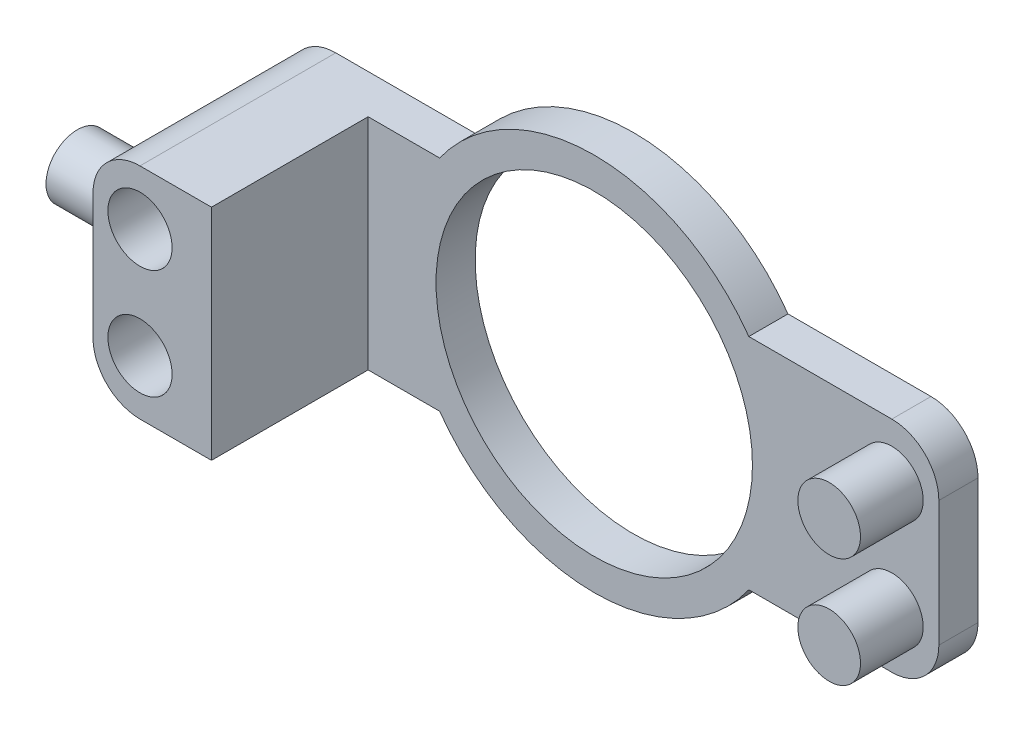
ISO-10303-21;
HEADER;
FILE_DESCRIPTION(('STEP AP214'),'2;1');
FILE_NAME('part.step','',(''),(''),'','','');
FILE_SCHEMA(('AUTOMOTIVE_DESIGN { 1 0 10303 214 1 1 1 1 }'));
ENDSEC;
DATA;
#1=APPLICATION_CONTEXT('core data for automotive mechanical design processes');
#2=APPLICATION_PROTOCOL_DEFINITION('international standard','automotive_design',2000,#1);
#3=PRODUCT_CONTEXT('',#1,'mechanical');
#4=PRODUCT('Part','Part','',(#3));
#5=PRODUCT_RELATED_PRODUCT_CATEGORY('part','',(#4));
#6=PRODUCT_DEFINITION_FORMATION('','',#4);
#7=PRODUCT_DEFINITION_CONTEXT('part definition',#1,'design');
#8=PRODUCT_DEFINITION('design','',#6,#7);
#9=PRODUCT_DEFINITION_SHAPE('','',#8);
#10=(LENGTH_UNIT() NAMED_UNIT(*) SI_UNIT(.MILLI.,.METRE.));
#11=(NAMED_UNIT(*) PLANE_ANGLE_UNIT() SI_UNIT($,.RADIAN.));
#12=(NAMED_UNIT(*) SI_UNIT($,.STERADIAN.) SOLID_ANGLE_UNIT());
#13=UNCERTAINTY_MEASURE_WITH_UNIT(LENGTH_MEASURE(1.E-05),#10,'distance_accuracy_value','');
#14=(GEOMETRIC_REPRESENTATION_CONTEXT(3) GLOBAL_UNCERTAINTY_ASSIGNED_CONTEXT((#13)) GLOBAL_UNIT_ASSIGNED_CONTEXT((#10,
#11,#12)) REPRESENTATION_CONTEXT('',''));
#15=CARTESIAN_POINT('',(0.,0.,0.));
#16=DIRECTION('',(0.,0.,1.));
#17=DIRECTION('',(1.,0.,0.));
#18=AXIS2_PLACEMENT_3D('',#15,#16,#17);
#19=CARTESIAN_POINT('',(0.,0.,2.5));
#20=DIRECTION('',(0.,0.,1.));
#21=DIRECTION('',(1.,0.,0.));
#22=AXIS2_PLACEMENT_3D('',#19,#20,#21);
#23=PLANE('',#22);
#24=CARTESIAN_POINT('',(19.,-3.5,2.5));
#25=DIRECTION('',(0.,0.,1.));
#26=DIRECTION('',(1.,0.,0.));
#27=AXIS2_PLACEMENT_3D('',#24,#25,#26);
#28=CIRCLE('',#27,2.);
#29=CARTESIAN_POINT('',(21.,-3.5,2.5));
#30=VERTEX_POINT('',#29);
#31=EDGE_CURVE('E277',#30,#30,#28,.T.);
#32=ORIENTED_EDGE('',*,*,#31,.F.);
#33=EDGE_LOOP('',(#32));
#34=FACE_BOUND('',#33,.T.);
#35=CARTESIAN_POINT('',(19.,3.5,2.5));
#36=DIRECTION('',(0.,0.,1.));
#37=DIRECTION('',(1.,0.,0.));
#38=AXIS2_PLACEMENT_3D('',#35,#36,#37);
#39=CIRCLE('',#38,2.);
#40=CARTESIAN_POINT('',(21.,3.5,2.5));
#41=VERTEX_POINT('',#40);
#42=EDGE_CURVE('E274',#41,#41,#39,.T.);
#43=ORIENTED_EDGE('',*,*,#42,.F.);
#44=EDGE_LOOP('',(#43));
#45=FACE_BOUND('',#44,.T.);
#46=CARTESIAN_POINT('',(0.,0.,2.5));
#47=DIRECTION('',(0.,0.,1.));
#48=DIRECTION('',(1.,0.,0.));
#49=AXIS2_PLACEMENT_3D('',#46,#47,#48);
#50=CIRCLE('',#49,10.1);
#51=CARTESIAN_POINT('',(10.1,0.,2.5));
#52=VERTEX_POINT('',#51);
#53=EDGE_CURVE('E189',#52,#52,#50,.T.);
#54=ORIENTED_EDGE('',*,*,#53,.F.);
#55=EDGE_LOOP('',(#54));
#56=FACE_BOUND('',#55,.T.);
#57=DIRECTION('',(1.,0.,0.));
#58=VECTOR('',#57,1.);
#59=CARTESIAN_POINT('',(0.,7.,2.5));
#60=LINE('',#59,#58);
#61=CARTESIAN_POINT('',(-14.4348252248687,7.,2.5));
#62=VERTEX_POINT('',#61);
#63=CARTESIAN_POINT('',(-9.86965044973731,7.,2.5));
#64=VERTEX_POINT('',#63);
#65=EDGE_CURVE('E199',#62,#64,#60,.T.);
#66=ORIENTED_EDGE('',*,*,#65,.F.);
#67=DIRECTION('',(0.,-1.,0.));
#68=VECTOR('',#67,1.);
#69=CARTESIAN_POINT('',(-14.4348252248687,0.,2.5));
#70=LINE('',#69,#68);
#71=CARTESIAN_POINT('',(-14.4348252248687,-7.00000000000001,2.5));
#72=VERTEX_POINT('',#71);
#73=EDGE_CURVE('E155',#62,#72,#70,.T.);
#74=ORIENTED_EDGE('',*,*,#73,.T.);
#75=DIRECTION('',(1.,0.,0.));
#76=VECTOR('',#75,1.);
#77=CARTESIAN_POINT('',(0.,-7.00000000000001,2.5));
#78=LINE('',#77,#76);
#79=CARTESIAN_POINT('',(-9.86965044973731,-7.00000000000001,2.5));
#80=VERTEX_POINT('',#79);
#81=EDGE_CURVE('E201',#72,#80,#78,.T.);
#82=ORIENTED_EDGE('',*,*,#81,.T.);
#83=CARTESIAN_POINT('',(0.,0.,2.5));
#84=DIRECTION('',(0.,0.,1.));
#85=DIRECTION('',(1.,0.,0.));
#86=AXIS2_PLACEMENT_3D('',#83,#84,#85);
#87=CIRCLE('',#86,12.1);
#88=CARTESIAN_POINT('',(9.86965044973731,-7.00000000000001,2.5));
#89=VERTEX_POINT('',#88);
#90=EDGE_CURVE('E203',#80,#89,#87,.T.);
#91=ORIENTED_EDGE('',*,*,#90,.T.);
#92=DIRECTION('',(1.,0.,0.));
#93=VECTOR('',#92,1.);
#94=CARTESIAN_POINT('',(0.,-7.00000000000001,2.5));
#95=LINE('',#94,#93);
#96=CARTESIAN_POINT('',(19.,-7.00000000000001,2.5));
#97=VERTEX_POINT('',#96);
#98=EDGE_CURVE('E206',#89,#97,#95,.T.);
#99=ORIENTED_EDGE('',*,*,#98,.T.);
#100=CARTESIAN_POINT('',(19.,-4.00000000000001,2.5));
#101=DIRECTION('',(0.,0.,1.));
#102=DIRECTION('',(1.,0.,0.));
#103=AXIS2_PLACEMENT_3D('',#100,#101,#102);
#104=CIRCLE('',#103,3.);
#105=CARTESIAN_POINT('',(22.,-4.00000000000001,2.5));
#106=VERTEX_POINT('',#105);
#107=EDGE_CURVE('E260',#97,#106,#104,.T.);
#108=ORIENTED_EDGE('',*,*,#107,.T.);
#109=DIRECTION('',(0.,1.,0.));
#110=VECTOR('',#109,1.);
#111=CARTESIAN_POINT('',(22.,0.,2.5));
#112=LINE('',#111,#110);
#113=CARTESIAN_POINT('',(22.,4.00000000000001,2.5));
#114=VERTEX_POINT('',#113);
#115=EDGE_CURVE('E208',#106,#114,#112,.T.);
#116=ORIENTED_EDGE('',*,*,#115,.T.);
#117=CARTESIAN_POINT('',(19.,4.00000000000001,2.5));
#118=DIRECTION('',(0.,0.,1.));
#119=DIRECTION('',(1.,0.,0.));
#120=AXIS2_PLACEMENT_3D('',#117,#118,#119);
#121=CIRCLE('',#120,3.);
#122=CARTESIAN_POINT('',(19.,7.00000000000001,2.5));
#123=VERTEX_POINT('',#122);
#124=EDGE_CURVE('E262',#114,#123,#121,.T.);
#125=ORIENTED_EDGE('',*,*,#124,.T.);
#126=DIRECTION('',(1.,0.,0.));
#127=VECTOR('',#126,1.);
#128=CARTESIAN_POINT('',(0.,7.,2.5));
#129=LINE('',#128,#127);
#130=CARTESIAN_POINT('',(9.86965044973731,7.,2.5));
#131=VERTEX_POINT('',#130);
#132=EDGE_CURVE('E192',#131,#123,#129,.T.);
#133=ORIENTED_EDGE('',*,*,#132,.F.);
#134=CARTESIAN_POINT('',(0.,0.,2.5));
#135=DIRECTION('',(0.,0.,1.));
#136=DIRECTION('',(1.,0.,0.));
#137=AXIS2_PLACEMENT_3D('',#134,#135,#136);
#138=CIRCLE('',#137,12.1);
#139=EDGE_CURVE('E196',#131,#64,#138,.T.);
#140=ORIENTED_EDGE('',*,*,#139,.T.);
#141=EDGE_LOOP('',(#66,#74,#82,#91,#99,#108,#116,#125,#133,#140));
#142=FACE_BOUND('',#141,.T.);
#143=ADVANCED_FACE('F49',(#34,#45,#56,#142),#23,.T.);
#144=CARTESIAN_POINT('',(0.,7.,2.5));
#145=DIRECTION('',(0.,1.,0.));
#146=DIRECTION('',(-1.,0.,0.));
#147=AXIS2_PLACEMENT_3D('',#144,#145,#146);
#148=PLANE('',#147);
#149=ORIENTED_EDGE('',*,*,#132,.T.);
#150=DIRECTION('',(0.,0.,-1.));
#151=VECTOR('',#150,1.);
#152=CARTESIAN_POINT('',(19.,7.00000000000001,0.));
#153=LINE('',#152,#151);
#154=CARTESIAN_POINT('',(19.,7.00000000000001,0.));
#155=VERTEX_POINT('',#154);
#156=EDGE_CURVE('E244',#123,#155,#153,.T.);
#157=ORIENTED_EDGE('',*,*,#156,.T.);
#158=DIRECTION('',(1.,0.,0.));
#159=VECTOR('',#158,1.);
#160=CARTESIAN_POINT('',(0.,7.,0.));
#161=LINE('',#160,#159);
#162=CARTESIAN_POINT('',(9.86965044973731,7.,0.));
#163=VERTEX_POINT('',#162);
#164=EDGE_CURVE('E214',#163,#155,#161,.T.);
#165=ORIENTED_EDGE('',*,*,#164,.F.);
#166=DIRECTION('',(0.,0.,-1.));
#167=VECTOR('',#166,1.);
#168=CARTESIAN_POINT('',(9.86965044973731,7.,2.5));
#169=LINE('',#168,#167);
#170=EDGE_CURVE('E242',#131,#163,#169,.T.);
#171=ORIENTED_EDGE('',*,*,#170,.F.);
#172=EDGE_LOOP('',(#149,#157,#165,#171));
#173=FACE_BOUND('',#172,.T.);
#174=ADVANCED_FACE('F296',(#173),#148,.T.);
#175=CARTESIAN_POINT('',(0.,0.,2.5));
#176=DIRECTION('',(0.,0.,-1.));
#177=DIRECTION('',(-1.,0.,0.));
#178=AXIS2_PLACEMENT_3D('',#175,#176,#177);
#179=CYLINDRICAL_SURFACE('',#178,12.1);
#180=CARTESIAN_POINT('',(0.,0.,0.));
#181=DIRECTION('',(0.,0.,1.));
#182=DIRECTION('',(1.,0.,0.));
#183=AXIS2_PLACEMENT_3D('',#180,#181,#182);
#184=CIRCLE('',#183,12.1);
#185=CARTESIAN_POINT('',(-9.86965044973731,7.,0.));
#186=VERTEX_POINT('',#185);
#187=EDGE_CURVE('E217',#163,#186,#184,.T.);
#188=ORIENTED_EDGE('',*,*,#187,.T.);
#189=DIRECTION('',(0.,0.,-1.));
#190=VECTOR('',#189,1.);
#191=CARTESIAN_POINT('',(-9.86965044973731,7.,2.5));
#192=LINE('',#191,#190);
#193=EDGE_CURVE('E239',#64,#186,#192,.T.);
#194=ORIENTED_EDGE('',*,*,#193,.F.);
#195=ORIENTED_EDGE('',*,*,#139,.F.);
#196=ORIENTED_EDGE('',*,*,#170,.T.);
#197=EDGE_LOOP('',(#188,#194,#195,#196));
#198=FACE_BOUND('',#197,.T.);
#199=ADVANCED_FACE('F302',(#198),#179,.T.);
#200=CARTESIAN_POINT('',(0.,7.,2.5));
#201=DIRECTION('',(0.,1.,0.));
#202=DIRECTION('',(-1.,0.,0.));
#203=AXIS2_PLACEMENT_3D('',#200,#201,#202);
#204=PLANE('',#203);
#205=DIRECTION('',(1.,0.,0.));
#206=VECTOR('',#205,1.);
#207=CARTESIAN_POINT('',(0.,7.,0.));
#208=LINE('',#207,#206);
#209=CARTESIAN_POINT('',(-19.,7.,0.));
#210=VERTEX_POINT('',#209);
#211=EDGE_CURVE('E220',#210,#186,#208,.T.);
#212=ORIENTED_EDGE('',*,*,#211,.F.);
#213=DIRECTION('',(0.,0.,-1.));
#214=VECTOR('',#213,1.);
#215=CARTESIAN_POINT('',(-19.,7.,2.5));
#216=LINE('',#215,#214);
#217=CARTESIAN_POINT('',(-19.,7.,12.5));
#218=VERTEX_POINT('',#217);
#219=EDGE_CURVE('E165',#210,#218,#216,.F.);
#220=ORIENTED_EDGE('',*,*,#219,.T.);
#221=DIRECTION('',(-1.,0.,0.));
#222=VECTOR('',#221,1.);
#223=CARTESIAN_POINT('',(0.,7.,12.5));
#224=LINE('',#223,#222);
#225=CARTESIAN_POINT('',(-14.4348252248687,7.,12.5));
#226=VERTEX_POINT('',#225);
#227=EDGE_CURVE('E161',#226,#218,#224,.T.);
#228=ORIENTED_EDGE('',*,*,#227,.F.);
#229=DIRECTION('',(0.,0.,-1.));
#230=VECTOR('',#229,1.);
#231=CARTESIAN_POINT('',(-14.4348252248687,7.,12.5));
#232=LINE('',#231,#230);
#233=EDGE_CURVE('E150',#226,#62,#232,.T.);
#234=ORIENTED_EDGE('',*,*,#233,.T.);
#235=ORIENTED_EDGE('',*,*,#65,.T.);
#236=ORIENTED_EDGE('',*,*,#193,.T.);
#237=EDGE_LOOP('',(#212,#220,#228,#234,#235,#236));
#238=FACE_BOUND('',#237,.T.);
#239=ADVANCED_FACE('F163',(#238),#204,.T.);
#240=CARTESIAN_POINT('',(-22.,0.,2.5));
#241=DIRECTION('',(-1.,0.,0.));
#242=DIRECTION('',(0.,0.,1.));
#243=AXIS2_PLACEMENT_3D('',#240,#241,#242);
#244=PLANE('',#243);
#245=CARTESIAN_POINT('',(-22.,0.,7.5));
#246=DIRECTION('',(-1.,0.,0.));
#247=DIRECTION('',(0.,0.,1.));
#248=AXIS2_PLACEMENT_3D('',#245,#246,#247);
#249=CIRCLE('',#248,3.);
#250=CARTESIAN_POINT('',(-22.,0.,10.5));
#251=VERTEX_POINT('',#250);
#252=EDGE_CURVE('E12',#251,#251,#249,.F.);
#253=ORIENTED_EDGE('',*,*,#252,.T.);
#254=EDGE_LOOP('',(#253));
#255=FACE_BOUND('',#254,.T.);
#256=DIRECTION('',(0.,1.,0.));
#257=VECTOR('',#256,1.);
#258=CARTESIAN_POINT('',(-22.,0.,0.));
#259=LINE('',#258,#257);
#260=CARTESIAN_POINT('',(-22.,-4.00000000000001,0.));
#261=VERTEX_POINT('',#260);
#262=CARTESIAN_POINT('',(-22.,4.,0.));
#263=VERTEX_POINT('',#262);
#264=EDGE_CURVE('E222',#261,#263,#259,.T.);
#265=ORIENTED_EDGE('',*,*,#264,.F.);
#266=DIRECTION('',(0.,0.,-1.));
#267=VECTOR('',#266,1.);
#268=CARTESIAN_POINT('',(-22.,-4.00000000000001,2.5));
#269=LINE('',#268,#267);
#270=CARTESIAN_POINT('',(-22.,-4.00000000000001,12.5));
#271=VERTEX_POINT('',#270);
#272=EDGE_CURVE('E271',#261,#271,#269,.F.);
#273=ORIENTED_EDGE('',*,*,#272,.T.);
#274=DIRECTION('',(0.,-1.,0.));
#275=VECTOR('',#274,1.);
#276=CARTESIAN_POINT('',(-22.,0.,12.5));
#277=LINE('',#276,#275);
#278=CARTESIAN_POINT('',(-22.,4.,12.5));
#279=VERTEX_POINT('',#278);
#280=EDGE_CURVE('E182',#279,#271,#277,.T.);
#281=ORIENTED_EDGE('',*,*,#280,.F.);
#282=DIRECTION('',(0.,0.,-1.));
#283=VECTOR('',#282,1.);
#284=CARTESIAN_POINT('',(-22.,4.,2.5));
#285=LINE('',#284,#283);
#286=EDGE_CURVE('E268',#279,#263,#285,.T.);
#287=ORIENTED_EDGE('',*,*,#286,.T.);
#288=EDGE_LOOP('',(#265,#273,#281,#287));
#289=FACE_BOUND('',#288,.T.);
#290=ADVANCED_FACE('F330',(#255,#289),#244,.T.);
#291=CARTESIAN_POINT('',(0.,-7.00000000000001,2.5));
#292=DIRECTION('',(0.,1.,0.));
#293=DIRECTION('',(-1.,0.,0.));
#294=AXIS2_PLACEMENT_3D('',#291,#292,#293);
#295=PLANE('',#294);
#296=ORIENTED_EDGE('',*,*,#81,.F.);
#297=DIRECTION('',(0.,0.,-1.));
#298=VECTOR('',#297,1.);
#299=CARTESIAN_POINT('',(-14.4348252248687,-7.00000000000001,12.5));
#300=LINE('',#299,#298);
#301=CARTESIAN_POINT('',(-14.4348252248687,-7.00000000000001,12.5));
#302=VERTEX_POINT('',#301);
#303=EDGE_CURVE('E64',#302,#72,#300,.T.);
#304=ORIENTED_EDGE('',*,*,#303,.F.);
#305=DIRECTION('',(1.,0.,0.));
#306=VECTOR('',#305,1.);
#307=CARTESIAN_POINT('',(0.,-7.00000000000001,12.5));
#308=LINE('',#307,#306);
#309=CARTESIAN_POINT('',(-19.,-7.00000000000001,12.5));
#310=VERTEX_POINT('',#309);
#311=EDGE_CURVE('E174',#310,#302,#308,.T.);
#312=ORIENTED_EDGE('',*,*,#311,.F.);
#313=DIRECTION('',(0.,0.,-1.));
#314=VECTOR('',#313,1.);
#315=CARTESIAN_POINT('',(-19.,-7.00000000000001,0.));
#316=LINE('',#315,#314);
#317=CARTESIAN_POINT('',(-19.,-7.00000000000001,0.));
#318=VERTEX_POINT('',#317);
#319=EDGE_CURVE('E265',#310,#318,#316,.T.);
#320=ORIENTED_EDGE('',*,*,#319,.T.);
#321=DIRECTION('',(1.,0.,0.));
#322=VECTOR('',#321,1.);
#323=CARTESIAN_POINT('',(0.,-7.00000000000001,0.));
#324=LINE('',#323,#322);
#325=CARTESIAN_POINT('',(-9.86965044973731,-7.00000000000001,0.));
#326=VERTEX_POINT('',#325);
#327=EDGE_CURVE('E225',#318,#326,#324,.T.);
#328=ORIENTED_EDGE('',*,*,#327,.T.);
#329=DIRECTION('',(0.,0.,-1.));
#330=VECTOR('',#329,1.);
#331=CARTESIAN_POINT('',(-9.86965044973731,-7.00000000000001,2.5));
#332=LINE('',#331,#330);
#333=EDGE_CURVE('E236',#80,#326,#332,.T.);
#334=ORIENTED_EDGE('',*,*,#333,.F.);
#335=EDGE_LOOP('',(#296,#304,#312,#320,#328,#334));
#336=FACE_BOUND('',#335,.T.);
#337=ADVANCED_FACE('F326',(#336),#295,.F.);
#338=CARTESIAN_POINT('',(0.,0.,2.5));
#339=DIRECTION('',(0.,0.,-1.));
#340=DIRECTION('',(-1.,0.,0.));
#341=AXIS2_PLACEMENT_3D('',#338,#339,#340);
#342=CYLINDRICAL_SURFACE('',#341,12.1);
#343=CARTESIAN_POINT('',(0.,0.,0.));
#344=DIRECTION('',(0.,0.,1.));
#345=DIRECTION('',(1.,0.,0.));
#346=AXIS2_PLACEMENT_3D('',#343,#344,#345);
#347=CIRCLE('',#346,12.1);
#348=CARTESIAN_POINT('',(9.86965044973731,-7.00000000000001,0.));
#349=VERTEX_POINT('',#348);
#350=EDGE_CURVE('E227',#326,#349,#347,.T.);
#351=ORIENTED_EDGE('',*,*,#350,.T.);
#352=DIRECTION('',(0.,0.,-1.));
#353=VECTOR('',#352,1.);
#354=CARTESIAN_POINT('',(9.86965044973731,-7.00000000000001,2.5));
#355=LINE('',#354,#353);
#356=EDGE_CURVE('E211',#89,#349,#355,.T.);
#357=ORIENTED_EDGE('',*,*,#356,.F.);
#358=ORIENTED_EDGE('',*,*,#90,.F.);
#359=ORIENTED_EDGE('',*,*,#333,.T.);
#360=EDGE_LOOP('',(#351,#357,#358,#359));
#361=FACE_BOUND('',#360,.T.);
#362=ADVANCED_FACE('F323',(#361),#342,.T.);
#363=CARTESIAN_POINT('',(0.,-7.00000000000001,2.5));
#364=DIRECTION('',(0.,1.,0.));
#365=DIRECTION('',(-1.,0.,0.));
#366=AXIS2_PLACEMENT_3D('',#363,#364,#365);
#367=PLANE('',#366);
#368=DIRECTION('',(1.,0.,0.));
#369=VECTOR('',#368,1.);
#370=CARTESIAN_POINT('',(0.,-7.00000000000001,0.));
#371=LINE('',#370,#369);
#372=CARTESIAN_POINT('',(19.,-7.00000000000001,0.));
#373=VERTEX_POINT('',#372);
#374=EDGE_CURVE('E230',#349,#373,#371,.T.);
#375=ORIENTED_EDGE('',*,*,#374,.T.);
#376=DIRECTION('',(0.,0.,-1.));
#377=VECTOR('',#376,1.);
#378=CARTESIAN_POINT('',(19.,-7.00000000000001,2.5));
#379=LINE('',#378,#377);
#380=EDGE_CURVE('E72',#373,#97,#379,.F.);
#381=ORIENTED_EDGE('',*,*,#380,.T.);
#382=ORIENTED_EDGE('',*,*,#98,.F.);
#383=ORIENTED_EDGE('',*,*,#356,.T.);
#384=EDGE_LOOP('',(#375,#381,#382,#383));
#385=FACE_BOUND('',#384,.T.);
#386=ADVANCED_FACE('F320',(#385),#367,.F.);
#387=CARTESIAN_POINT('',(0.,0.,2.5));
#388=DIRECTION('',(0.,0.,-1.));
#389=DIRECTION('',(-1.,0.,0.));
#390=AXIS2_PLACEMENT_3D('',#387,#388,#389);
#391=CYLINDRICAL_SURFACE('',#390,10.1);
#392=ORIENTED_EDGE('',*,*,#53,.T.);
#393=EDGE_LOOP('',(#392));
#394=FACE_BOUND('',#393,.T.);
#395=CARTESIAN_POINT('',(0.,0.,0.));
#396=DIRECTION('',(0.,0.,1.));
#397=DIRECTION('',(1.,0.,0.));
#398=AXIS2_PLACEMENT_3D('',#395,#396,#397);
#399=CIRCLE('',#398,10.1);
#400=CARTESIAN_POINT('',(10.1,0.,0.));
#401=VERTEX_POINT('',#400);
#402=EDGE_CURVE('E158',#401,#401,#399,.T.);
#403=ORIENTED_EDGE('',*,*,#402,.F.);
#404=EDGE_LOOP('',(#403));
#405=FACE_BOUND('',#404,.T.);
#406=ADVANCED_FACE('F318',(#394,#405),#391,.F.);
#407=CARTESIAN_POINT('',(22.,0.,2.5));
#408=DIRECTION('',(-1.,0.,0.));
#409=DIRECTION('',(0.,0.,1.));
#410=AXIS2_PLACEMENT_3D('',#407,#408,#409);
#411=PLANE('',#410);
#412=DIRECTION('',(0.,1.,0.));
#413=VECTOR('',#412,1.);
#414=CARTESIAN_POINT('',(22.,0.,0.));
#415=LINE('',#414,#413);
#416=CARTESIAN_POINT('',(22.,-4.00000000000001,0.));
#417=VERTEX_POINT('',#416);
#418=CARTESIAN_POINT('',(22.,4.00000000000001,0.));
#419=VERTEX_POINT('',#418);
#420=EDGE_CURVE('E193',#417,#419,#415,.T.);
#421=ORIENTED_EDGE('',*,*,#420,.T.);
#422=DIRECTION('',(0.,0.,-1.));
#423=VECTOR('',#422,1.);
#424=CARTESIAN_POINT('',(22.,4.00000000000001,2.5));
#425=LINE('',#424,#423);
#426=EDGE_CURVE('E258',#419,#114,#425,.F.);
#427=ORIENTED_EDGE('',*,*,#426,.T.);
#428=ORIENTED_EDGE('',*,*,#115,.F.);
#429=DIRECTION('',(0.,0.,-1.));
#430=VECTOR('',#429,1.);
#431=CARTESIAN_POINT('',(22.,-4.00000000000001,2.5));
#432=LINE('',#431,#430);
#433=EDGE_CURVE('E255',#106,#417,#432,.T.);
#434=ORIENTED_EDGE('',*,*,#433,.T.);
#435=EDGE_LOOP('',(#421,#427,#428,#434));
#436=FACE_BOUND('',#435,.T.);
#437=ADVANCED_FACE('F314',(#436),#411,.F.);
#438=CARTESIAN_POINT('',(0.,0.,0.));
#439=DIRECTION('',(0.,0.,1.));
#440=DIRECTION('',(1.,0.,0.));
#441=AXIS2_PLACEMENT_3D('',#438,#439,#440);
#442=PLANE('',#441);
#443=ORIENTED_EDGE('',*,*,#402,.T.);
#444=EDGE_LOOP('',(#443));
#445=FACE_BOUND('',#444,.T.);
#446=ORIENTED_EDGE('',*,*,#164,.T.);
#447=CARTESIAN_POINT('',(19.,4.00000000000001,0.));
#448=DIRECTION('',(0.,0.,1.));
#449=DIRECTION('',(1.,0.,0.));
#450=AXIS2_PLACEMENT_3D('',#447,#448,#449);
#451=CIRCLE('',#450,3.);
#452=EDGE_CURVE('E253',#155,#419,#451,.F.);
#453=ORIENTED_EDGE('',*,*,#452,.T.);
#454=ORIENTED_EDGE('',*,*,#420,.F.);
#455=CARTESIAN_POINT('',(19.,-4.00000000000001,0.));
#456=DIRECTION('',(0.,0.,1.));
#457=DIRECTION('',(1.,0.,0.));
#458=AXIS2_PLACEMENT_3D('',#455,#456,#457);
#459=CIRCLE('',#458,3.);
#460=EDGE_CURVE('E251',#417,#373,#459,.F.);
#461=ORIENTED_EDGE('',*,*,#460,.T.);
#462=ORIENTED_EDGE('',*,*,#374,.F.);
#463=ORIENTED_EDGE('',*,*,#350,.F.);
#464=ORIENTED_EDGE('',*,*,#327,.F.);
#465=CARTESIAN_POINT('',(-19.,-4.00000000000001,0.));
#466=DIRECTION('',(0.,0.,1.));
#467=DIRECTION('',(1.,0.,0.));
#468=AXIS2_PLACEMENT_3D('',#465,#466,#467);
#469=CIRCLE('',#468,3.);
#470=EDGE_CURVE('E249',#318,#261,#469,.F.);
#471=ORIENTED_EDGE('',*,*,#470,.T.);
#472=ORIENTED_EDGE('',*,*,#264,.T.);
#473=CARTESIAN_POINT('',(-19.,4.,0.));
#474=DIRECTION('',(0.,0.,1.));
#475=DIRECTION('',(1.,0.,0.));
#476=AXIS2_PLACEMENT_3D('',#473,#474,#475);
#477=CIRCLE('',#476,3.);
#478=EDGE_CURVE('E247',#263,#210,#477,.F.);
#479=ORIENTED_EDGE('',*,*,#478,.T.);
#480=ORIENTED_EDGE('',*,*,#211,.T.);
#481=ORIENTED_EDGE('',*,*,#187,.F.);
#482=EDGE_LOOP('',(#446,#453,#454,#461,#462,#463,#464,#471,#472,#479,#480,#481));
#483=FACE_BOUND('',#482,.T.);
#484=ADVANCED_FACE('F310',(#445,#483),#442,.F.);
#485=CARTESIAN_POINT('',(19.,4.00000000000001,2.5));
#486=DIRECTION('',(0.,0.,1.));
#487=DIRECTION('',(1.,0.,0.));
#488=AXIS2_PLACEMENT_3D('',#485,#486,#487);
#489=CYLINDRICAL_SURFACE('',#488,3.);
#490=ORIENTED_EDGE('',*,*,#124,.F.);
#491=ORIENTED_EDGE('',*,*,#426,.F.);
#492=ORIENTED_EDGE('',*,*,#452,.F.);
#493=ORIENTED_EDGE('',*,*,#156,.F.);
#494=EDGE_LOOP('',(#490,#491,#492,#493));
#495=FACE_BOUND('',#494,.T.);
#496=ADVANCED_FACE('F313',(#495),#489,.T.);
#497=CARTESIAN_POINT('',(19.,-4.00000000000001,2.5));
#498=DIRECTION('',(0.,0.,-1.));
#499=DIRECTION('',(-1.,0.,0.));
#500=AXIS2_PLACEMENT_3D('',#497,#498,#499);
#501=CYLINDRICAL_SURFACE('',#500,3.);
#502=ORIENTED_EDGE('',*,*,#107,.F.);
#503=ORIENTED_EDGE('',*,*,#380,.F.);
#504=ORIENTED_EDGE('',*,*,#460,.F.);
#505=ORIENTED_EDGE('',*,*,#433,.F.);
#506=EDGE_LOOP('',(#502,#503,#504,#505));
#507=FACE_BOUND('',#506,.T.);
#508=ADVANCED_FACE('F345',(#507),#501,.T.);
#509=CARTESIAN_POINT('',(-19.,-4.00000000000001,2.5));
#510=DIRECTION('',(0.,0.,1.));
#511=DIRECTION('',(1.,0.,0.));
#512=AXIS2_PLACEMENT_3D('',#509,#510,#511);
#513=CYLINDRICAL_SURFACE('',#512,3.);
#514=ORIENTED_EDGE('',*,*,#319,.F.);
#515=CARTESIAN_POINT('',(-19.,-4.00000000000001,12.5));
#516=DIRECTION('',(0.,0.,1.));
#517=DIRECTION('',(1.,0.,0.));
#518=AXIS2_PLACEMENT_3D('',#515,#516,#517);
#519=CIRCLE('',#518,3.);
#520=EDGE_CURVE('E185',#271,#310,#519,.T.);
#521=ORIENTED_EDGE('',*,*,#520,.F.);
#522=ORIENTED_EDGE('',*,*,#272,.F.);
#523=ORIENTED_EDGE('',*,*,#470,.F.);
#524=EDGE_LOOP('',(#514,#521,#522,#523));
#525=FACE_BOUND('',#524,.T.);
#526=ADVANCED_FACE('F349',(#525),#513,.T.);
#527=CARTESIAN_POINT('',(-19.,4.,2.5));
#528=DIRECTION('',(0.,0.,-1.));
#529=DIRECTION('',(-1.,0.,0.));
#530=AXIS2_PLACEMENT_3D('',#527,#528,#529);
#531=CYLINDRICAL_SURFACE('',#530,3.);
#532=ORIENTED_EDGE('',*,*,#286,.F.);
#533=CARTESIAN_POINT('',(-19.,4.,12.5));
#534=DIRECTION('',(0.,0.,1.));
#535=DIRECTION('',(1.,0.,0.));
#536=AXIS2_PLACEMENT_3D('',#533,#534,#535);
#537=CIRCLE('',#536,3.);
#538=EDGE_CURVE('E169',#218,#279,#537,.T.);
#539=ORIENTED_EDGE('',*,*,#538,.F.);
#540=ORIENTED_EDGE('',*,*,#219,.F.);
#541=ORIENTED_EDGE('',*,*,#478,.F.);
#542=EDGE_LOOP('',(#532,#539,#540,#541));
#543=FACE_BOUND('',#542,.T.);
#544=ADVANCED_FACE('F352',(#543),#531,.T.);
#545=CARTESIAN_POINT('',(-14.4348252248687,0.,12.5));
#546=DIRECTION('',(1.,0.,0.));
#547=DIRECTION('',(0.,0.,-1.));
#548=AXIS2_PLACEMENT_3D('',#545,#546,#547);
#549=PLANE('',#548);
#550=ORIENTED_EDGE('',*,*,#73,.F.);
#551=ORIENTED_EDGE('',*,*,#233,.F.);
#552=DIRECTION('',(0.,-1.,0.));
#553=VECTOR('',#552,1.);
#554=CARTESIAN_POINT('',(-14.4348252248687,0.,12.5));
#555=LINE('',#554,#553);
#556=EDGE_CURVE('E154',#226,#302,#555,.T.);
#557=ORIENTED_EDGE('',*,*,#556,.T.);
#558=ORIENTED_EDGE('',*,*,#303,.T.);
#559=EDGE_LOOP('',(#550,#551,#557,#558));
#560=FACE_BOUND('',#559,.T.);
#561=ADVANCED_FACE('F152',(#560),#549,.T.);
#562=CARTESIAN_POINT('',(0.,0.,12.5));
#563=DIRECTION('',(0.,0.,1.));
#564=DIRECTION('',(1.,0.,0.));
#565=AXIS2_PLACEMENT_3D('',#562,#563,#564);
#566=PLANE('',#565);
#567=CARTESIAN_POINT('',(-19.,3.5,12.5));
#568=DIRECTION('',(0.,0.,1.));
#569=DIRECTION('',(1.,0.,0.));
#570=AXIS2_PLACEMENT_3D('',#567,#568,#569);
#571=CIRCLE('',#570,2.05);
#572=CARTESIAN_POINT('',(-16.95,3.5,12.5));
#573=VERTEX_POINT('',#572);
#574=EDGE_CURVE('E432',#573,#573,#571,.T.);
#575=ORIENTED_EDGE('',*,*,#574,.F.);
#576=EDGE_LOOP('',(#575));
#577=FACE_BOUND('',#576,.T.);
#578=CARTESIAN_POINT('',(-19.,-3.5,12.5));
#579=DIRECTION('',(0.,0.,1.));
#580=DIRECTION('',(1.,0.,0.));
#581=AXIS2_PLACEMENT_3D('',#578,#579,#580);
#582=CIRCLE('',#581,2.05);
#583=CARTESIAN_POINT('',(-16.95,-3.5,12.5));
#584=VERTEX_POINT('',#583);
#585=EDGE_CURVE('E433',#584,#584,#582,.T.);
#586=ORIENTED_EDGE('',*,*,#585,.F.);
#587=EDGE_LOOP('',(#586));
#588=FACE_BOUND('',#587,.T.);
#589=ORIENTED_EDGE('',*,*,#556,.F.);
#590=ORIENTED_EDGE('',*,*,#227,.T.);
#591=ORIENTED_EDGE('',*,*,#538,.T.);
#592=ORIENTED_EDGE('',*,*,#280,.T.);
#593=ORIENTED_EDGE('',*,*,#520,.T.);
#594=ORIENTED_EDGE('',*,*,#311,.T.);
#595=EDGE_LOOP('',(#589,#590,#591,#592,#593,#594));
#596=FACE_BOUND('',#595,.T.);
#597=ADVANCED_FACE('F171',(#577,#588,#596),#566,.T.);
#598=CARTESIAN_POINT('',(-28.,0.,7.5));
#599=DIRECTION('',(1.,0.,0.));
#600=DIRECTION('',(0.,1.,0.));
#601=AXIS2_PLACEMENT_3D('',#598,#599,#600);
#602=CYLINDRICAL_SURFACE('',#601,2.);
#603=CARTESIAN_POINT('',(-23.,0.,7.5));
#604=DIRECTION('',(-1.,0.,0.));
#605=DIRECTION('',(0.,0.,1.));
#606=AXIS2_PLACEMENT_3D('',#603,#604,#605);
#607=CIRCLE('',#606,2.);
#608=CARTESIAN_POINT('',(-23.,0.,9.5));
#609=VERTEX_POINT('',#608);
#610=EDGE_CURVE('E57',#609,#609,#607,.T.);
#611=ORIENTED_EDGE('',*,*,#610,.T.);
#612=EDGE_LOOP('',(#611));
#613=FACE_BOUND('',#612,.T.);
#614=CARTESIAN_POINT('',(-28.,0.,7.5));
#615=DIRECTION('',(-1.,0.,0.));
#616=DIRECTION('',(0.,-1.,0.));
#617=AXIS2_PLACEMENT_3D('',#614,#615,#616);
#618=CIRCLE('',#617,2.);
#619=CARTESIAN_POINT('',(-28.,-2.,7.5));
#620=VERTEX_POINT('',#619);
#621=EDGE_CURVE('E176',#620,#620,#618,.T.);
#622=ORIENTED_EDGE('',*,*,#621,.F.);
#623=EDGE_LOOP('',(#622));
#624=FACE_BOUND('',#623,.T.);
#625=ADVANCED_FACE('F282',(#613,#624),#602,.T.);
#626=CARTESIAN_POINT('',(-28.,0.,0.));
#627=DIRECTION('',(-1.,0.,0.));
#628=DIRECTION('',(0.,-1.,0.));
#629=AXIS2_PLACEMENT_3D('',#626,#627,#628);
#630=PLANE('',#629);
#631=ORIENTED_EDGE('',*,*,#621,.T.);
#632=EDGE_LOOP('',(#631));
#633=FACE_BOUND('',#632,.T.);
#634=ADVANCED_FACE('F391',(#633),#630,.T.);
#635=CARTESIAN_POINT('',(19.,3.5,6.5));
#636=DIRECTION('',(0.,0.,-1.));
#637=DIRECTION('',(-1.,0.,0.));
#638=AXIS2_PLACEMENT_3D('',#635,#636,#637);
#639=CYLINDRICAL_SURFACE('',#638,2.);
#640=CARTESIAN_POINT('',(19.,3.5,6.5));
#641=DIRECTION('',(0.,0.,-1.));
#642=DIRECTION('',(-1.,0.,0.));
#643=AXIS2_PLACEMENT_3D('',#640,#641,#642);
#644=CIRCLE('',#643,2.);
#645=CARTESIAN_POINT('',(17.,3.5,6.5));
#646=VERTEX_POINT('',#645);
#647=EDGE_CURVE('E444',#646,#646,#644,.T.);
#648=ORIENTED_EDGE('',*,*,#647,.T.);
#649=EDGE_LOOP('',(#648));
#650=FACE_BOUND('',#649,.T.);
#651=ORIENTED_EDGE('',*,*,#42,.T.);
#652=EDGE_LOOP('',(#651));
#653=FACE_BOUND('',#652,.T.);
#654=ADVANCED_FACE('F398',(#650,#653),#639,.T.);
#655=CARTESIAN_POINT('',(19.,3.5,6.5));
#656=DIRECTION('',(0.,0.,-1.));
#657=DIRECTION('',(-1.,0.,0.));
#658=AXIS2_PLACEMENT_3D('',#655,#656,#657);
#659=PLANE('',#658);
#660=ORIENTED_EDGE('',*,*,#647,.F.);
#661=EDGE_LOOP('',(#660));
#662=FACE_BOUND('',#661,.T.);
#663=ADVANCED_FACE('F402',(#662),#659,.F.);
#664=CARTESIAN_POINT('',(19.,-3.5,6.5));
#665=DIRECTION('',(0.,0.,-1.));
#666=DIRECTION('',(-1.,0.,0.));
#667=AXIS2_PLACEMENT_3D('',#664,#665,#666);
#668=CYLINDRICAL_SURFACE('',#667,2.);
#669=CARTESIAN_POINT('',(19.,-3.5,6.5));
#670=DIRECTION('',(0.,0.,-1.));
#671=DIRECTION('',(-1.,0.,0.));
#672=AXIS2_PLACEMENT_3D('',#669,#670,#671);
#673=CIRCLE('',#672,2.);
#674=CARTESIAN_POINT('',(17.,-3.5,6.5));
#675=VERTEX_POINT('',#674);
#676=EDGE_CURVE('E435',#675,#675,#673,.T.);
#677=ORIENTED_EDGE('',*,*,#676,.T.);
#678=EDGE_LOOP('',(#677));
#679=FACE_BOUND('',#678,.T.);
#680=ORIENTED_EDGE('',*,*,#31,.T.);
#681=EDGE_LOOP('',(#680));
#682=FACE_BOUND('',#681,.T.);
#683=ADVANCED_FACE('F406',(#679,#682),#668,.T.);
#684=CARTESIAN_POINT('',(19.,-3.5,6.5));
#685=DIRECTION('',(0.,0.,-1.));
#686=DIRECTION('',(-1.,0.,0.));
#687=AXIS2_PLACEMENT_3D('',#684,#685,#686);
#688=PLANE('',#687);
#689=ORIENTED_EDGE('',*,*,#676,.F.);
#690=EDGE_LOOP('',(#689));
#691=FACE_BOUND('',#690,.T.);
#692=ADVANCED_FACE('F408',(#691),#688,.F.);
#693=CARTESIAN_POINT('',(-19.,-3.5,8.5));
#694=DIRECTION('',(0.,0.,1.));
#695=DIRECTION('',(1.,0.,0.));
#696=AXIS2_PLACEMENT_3D('',#693,#694,#695);
#697=CYLINDRICAL_SURFACE('',#696,2.05);
#698=CARTESIAN_POINT('',(-19.,-3.5,8.5));
#699=DIRECTION('',(0.,0.,1.));
#700=DIRECTION('',(1.,0.,0.));
#701=AXIS2_PLACEMENT_3D('',#698,#699,#700);
#702=CIRCLE('',#701,2.05);
#703=CARTESIAN_POINT('',(-16.95,-3.5,8.5));
#704=VERTEX_POINT('',#703);
#705=EDGE_CURVE('E438',#704,#704,#702,.T.);
#706=ORIENTED_EDGE('',*,*,#705,.F.);
#707=EDGE_LOOP('',(#706));
#708=FACE_BOUND('',#707,.T.);
#709=ORIENTED_EDGE('',*,*,#585,.T.);
#710=EDGE_LOOP('',(#709));
#711=FACE_BOUND('',#710,.T.);
#712=ADVANCED_FACE('F411',(#708,#711),#697,.F.);
#713=CARTESIAN_POINT('',(-19.,-3.5,8.5));
#714=DIRECTION('',(0.,0.,1.));
#715=DIRECTION('',(1.,0.,0.));
#716=AXIS2_PLACEMENT_3D('',#713,#714,#715);
#717=PLANE('',#716);
#718=ORIENTED_EDGE('',*,*,#705,.T.);
#719=EDGE_LOOP('',(#718));
#720=FACE_BOUND('',#719,.T.);
#721=ADVANCED_FACE('F416',(#720),#717,.T.);
#722=CARTESIAN_POINT('',(-19.,3.5,8.5));
#723=DIRECTION('',(0.,0.,1.));
#724=DIRECTION('',(1.,0.,0.));
#725=AXIS2_PLACEMENT_3D('',#722,#723,#724);
#726=CYLINDRICAL_SURFACE('',#725,2.05);
#727=CARTESIAN_POINT('',(-19.,3.5,8.5));
#728=DIRECTION('',(0.,0.,1.));
#729=DIRECTION('',(1.,0.,0.));
#730=AXIS2_PLACEMENT_3D('',#727,#728,#729);
#731=CIRCLE('',#730,2.05);
#732=CARTESIAN_POINT('',(-16.95,3.5,8.5));
#733=VERTEX_POINT('',#732);
#734=EDGE_CURVE('E430',#733,#733,#731,.T.);
#735=ORIENTED_EDGE('',*,*,#734,.F.);
#736=EDGE_LOOP('',(#735));
#737=FACE_BOUND('',#736,.T.);
#738=ORIENTED_EDGE('',*,*,#574,.T.);
#739=EDGE_LOOP('',(#738));
#740=FACE_BOUND('',#739,.T.);
#741=ADVANCED_FACE('F291',(#737,#740),#726,.F.);
#742=CARTESIAN_POINT('',(-19.,3.5,8.5));
#743=DIRECTION('',(0.,0.,1.));
#744=DIRECTION('',(1.,0.,0.));
#745=AXIS2_PLACEMENT_3D('',#742,#743,#744);
#746=PLANE('',#745);
#747=ORIENTED_EDGE('',*,*,#734,.T.);
#748=EDGE_LOOP('',(#747));
#749=FACE_BOUND('',#748,.T.);
#750=ADVANCED_FACE('F286',(#749),#746,.T.);
#751=CARTESIAN_POINT('',(-23.,0.,7.5));
#752=DIRECTION('',(-1.,0.,0.));
#753=DIRECTION('',(0.,0.,1.));
#754=AXIS2_PLACEMENT_3D('',#751,#752,#753);
#755=TOROIDAL_SURFACE('',#754,3.,1.);
#756=ORIENTED_EDGE('',*,*,#252,.F.);
#757=EDGE_LOOP('',(#756));
#758=FACE_BOUND('',#757,.T.);
#759=ORIENTED_EDGE('',*,*,#610,.F.);
#760=EDGE_LOOP('',(#759));
#761=FACE_BOUND('',#760,.T.);
#762=ADVANCED_FACE('F51',(#758,#761),#755,.F.);
#763=CLOSED_SHELL('',(#143,#174,#199,#239,#290,#337,#362,#386,#406,#437,#484,#496,#508,#526,
#544,#561,#597,#625,#634,#654,#663,#683,#692,#712,#721,#741,#750,#762));
#764=MANIFOLD_SOLID_BREP('B2',#763);
#765=ADVANCED_BREP_SHAPE_REPRESENTATION('',(#18,#764),#14);
#766=SHAPE_DEFINITION_REPRESENTATION(#9,#765);
ENDSEC;
END-ISO-10303-21;
